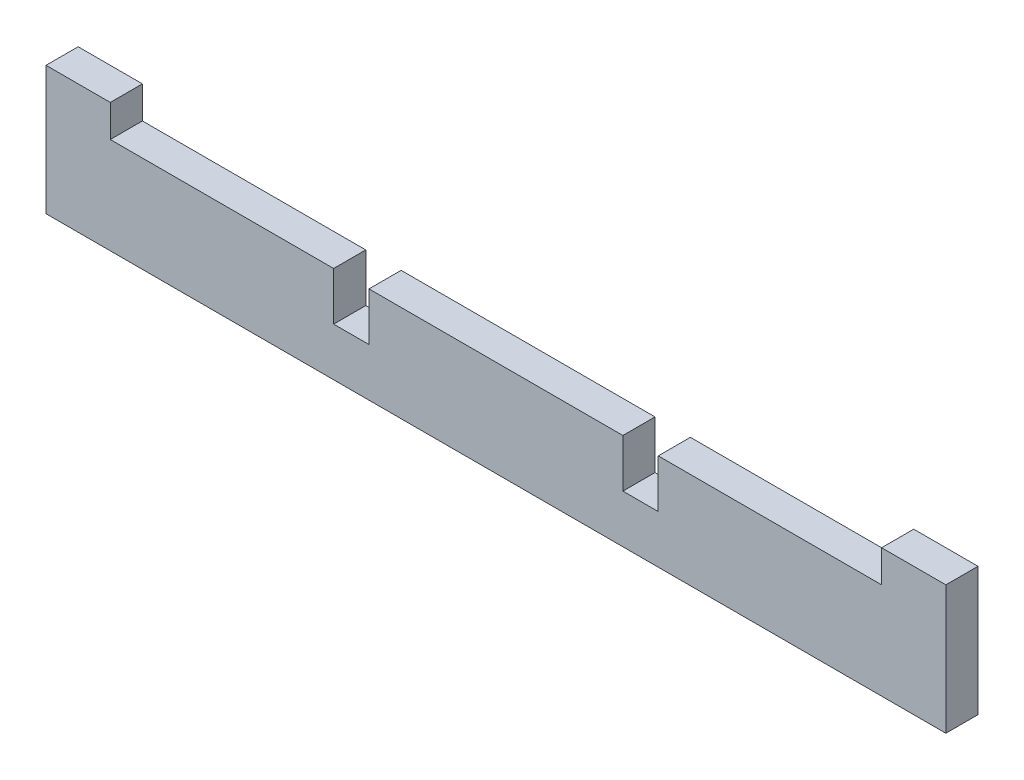
ISO-10303-21;
HEADER;
FILE_DESCRIPTION(('STEP AP214'),'2;1');
FILE_NAME('part.step','',(''),(''),'','','');
FILE_SCHEMA(('AUTOMOTIVE_DESIGN { 1 0 10303 214 1 1 1 1 }'));
ENDSEC;
DATA;
#1=APPLICATION_CONTEXT('core data for automotive mechanical design processes');
#2=APPLICATION_PROTOCOL_DEFINITION('international standard','automotive_design',2000,#1);
#3=PRODUCT_CONTEXT('',#1,'mechanical');
#4=PRODUCT('Part','Part','',(#3));
#5=PRODUCT_RELATED_PRODUCT_CATEGORY('part','',(#4));
#6=PRODUCT_DEFINITION_FORMATION('','',#4);
#7=PRODUCT_DEFINITION_CONTEXT('part definition',#1,'design');
#8=PRODUCT_DEFINITION('design','',#6,#7);
#9=PRODUCT_DEFINITION_SHAPE('','',#8);
#10=(LENGTH_UNIT() NAMED_UNIT(*) SI_UNIT(.MILLI.,.METRE.));
#11=(NAMED_UNIT(*) PLANE_ANGLE_UNIT() SI_UNIT($,.RADIAN.));
#12=(NAMED_UNIT(*) SI_UNIT($,.STERADIAN.) SOLID_ANGLE_UNIT());
#13=UNCERTAINTY_MEASURE_WITH_UNIT(LENGTH_MEASURE(1.E-05),#10,'distance_accuracy_value','');
#14=(GEOMETRIC_REPRESENTATION_CONTEXT(3) GLOBAL_UNCERTAINTY_ASSIGNED_CONTEXT((#13)) GLOBAL_UNIT_ASSIGNED_CONTEXT((#10,
#11,#12)) REPRESENTATION_CONTEXT('',''));
#15=CARTESIAN_POINT('',(0.,0.,0.));
#16=DIRECTION('',(0.,0.,1.));
#17=DIRECTION('',(1.,0.,0.));
#18=AXIS2_PLACEMENT_3D('',#15,#16,#17);
#19=CARTESIAN_POINT('',(663.280484651778,-183.645557824956,2.5));
#20=DIRECTION('',(0.,-1.,0.));
#21=DIRECTION('',(1.,0.,0.));
#22=AXIS2_PLACEMENT_3D('',#19,#20,#21);
#23=PLANE('',#22);
#24=DIRECTION('',(-1.,0.,0.));
#25=VECTOR('',#24,1.);
#26=CARTESIAN_POINT('',(663.280484651778,-183.645557824956,-2.5));
#27=LINE('',#26,#25);
#28=CARTESIAN_POINT('',(673.280484651779,-183.645557824956,-2.5));
#29=VERTEX_POINT('',#28);
#30=CARTESIAN_POINT('',(663.280484651778,-183.645557824956,-2.5));
#31=VERTEX_POINT('',#30);
#32=EDGE_CURVE('E176',#29,#31,#27,.T.);
#33=ORIENTED_EDGE('',*,*,#32,.T.);
#34=DIRECTION('',(0.,0.,-1.));
#35=VECTOR('',#34,1.);
#36=CARTESIAN_POINT('',(663.280484651778,-183.645557824956,2.5));
#37=LINE('',#36,#35);
#38=CARTESIAN_POINT('',(663.280484651778,-183.645557824956,2.5));
#39=VERTEX_POINT('',#38);
#40=EDGE_CURVE('E11',#39,#31,#37,.T.);
#41=ORIENTED_EDGE('',*,*,#40,.F.);
#42=DIRECTION('',(-1.,0.,0.));
#43=VECTOR('',#42,1.);
#44=CARTESIAN_POINT('',(663.280484651778,-183.645557824956,2.5));
#45=LINE('',#44,#43);
#46=CARTESIAN_POINT('',(673.280484651779,-183.645557824956,2.5));
#47=VERTEX_POINT('',#46);
#48=EDGE_CURVE('E206',#47,#39,#45,.T.);
#49=ORIENTED_EDGE('',*,*,#48,.F.);
#50=DIRECTION('',(0.,0.,-1.));
#51=VECTOR('',#50,1.);
#52=CARTESIAN_POINT('',(673.280484651779,-183.645557824956,2.5));
#53=LINE('',#52,#51);
#54=EDGE_CURVE('E172',#47,#29,#53,.T.);
#55=ORIENTED_EDGE('',*,*,#54,.T.);
#56=EDGE_LOOP('',(#33,#41,#49,#55));
#57=FACE_BOUND('',#56,.T.);
#58=ADVANCED_FACE('F32',(#57),#23,.F.);
#59=CARTESIAN_POINT('',(663.280484651778,-188.645557824956,2.5));
#60=DIRECTION('',(1.,0.,0.));
#61=DIRECTION('',(0.,0.,-1.));
#62=AXIS2_PLACEMENT_3D('',#59,#60,#61);
#63=PLANE('',#62);
#64=DIRECTION('',(0.,-1.,0.));
#65=VECTOR('',#64,1.);
#66=CARTESIAN_POINT('',(663.280484651778,-188.645557824956,-2.5));
#67=LINE('',#66,#65);
#68=CARTESIAN_POINT('',(663.280484651778,-188.645557824956,-2.5));
#69=VERTEX_POINT('',#68);
#70=EDGE_CURVE('E179',#31,#69,#67,.T.);
#71=ORIENTED_EDGE('',*,*,#70,.T.);
#72=DIRECTION('',(0.,0.,-1.));
#73=VECTOR('',#72,1.);
#74=CARTESIAN_POINT('',(663.280484651778,-188.645557824956,2.5));
#75=LINE('',#74,#73);
#76=CARTESIAN_POINT('',(663.280484651778,-188.645557824956,2.5));
#77=VERTEX_POINT('',#76);
#78=EDGE_CURVE('E40',#77,#69,#75,.T.);
#79=ORIENTED_EDGE('',*,*,#78,.F.);
#80=DIRECTION('',(0.,-1.,0.));
#81=VECTOR('',#80,1.);
#82=CARTESIAN_POINT('',(663.280484651778,-188.645557824956,2.5));
#83=LINE('',#82,#81);
#84=EDGE_CURVE('E115',#39,#77,#83,.T.);
#85=ORIENTED_EDGE('',*,*,#84,.F.);
#86=ORIENTED_EDGE('',*,*,#40,.T.);
#87=EDGE_LOOP('',(#71,#79,#85,#86));
#88=FACE_BOUND('',#87,.T.);
#89=ADVANCED_FACE('F304',(#88),#63,.F.);
#90=CARTESIAN_POINT('',(663.280484651778,-188.645557824956,2.5));
#91=DIRECTION('',(0.,-1.,0.));
#92=DIRECTION('',(0.,0.,-1.));
#93=AXIS2_PLACEMENT_3D('',#90,#91,#92);
#94=PLANE('',#93);
#95=DIRECTION('',(-1.,0.,0.));
#96=VECTOR('',#95,1.);
#97=CARTESIAN_POINT('',(663.280484651778,-188.645557824956,-2.5));
#98=LINE('',#97,#96);
#99=CARTESIAN_POINT('',(628.530484651779,-188.645557824956,-2.5));
#100=VERTEX_POINT('',#99);
#101=EDGE_CURVE('E181',#69,#100,#98,.T.);
#102=ORIENTED_EDGE('',*,*,#101,.T.);
#103=DIRECTION('',(0.,0.,-1.));
#104=VECTOR('',#103,1.);
#105=CARTESIAN_POINT('',(628.530484651779,-188.645557824956,2.5));
#106=LINE('',#105,#104);
#107=CARTESIAN_POINT('',(628.530484651779,-188.645557824956,2.5));
#108=VERTEX_POINT('',#107);
#109=EDGE_CURVE('E237',#108,#100,#106,.T.);
#110=ORIENTED_EDGE('',*,*,#109,.F.);
#111=DIRECTION('',(-1.,0.,0.));
#112=VECTOR('',#111,1.);
#113=CARTESIAN_POINT('',(663.280484651778,-188.645557824956,2.5));
#114=LINE('',#113,#112);
#115=EDGE_CURVE('E245',#77,#108,#114,.T.);
#116=ORIENTED_EDGE('',*,*,#115,.F.);
#117=ORIENTED_EDGE('',*,*,#78,.T.);
#118=EDGE_LOOP('',(#102,#110,#116,#117));
#119=FACE_BOUND('',#118,.T.);
#120=ADVANCED_FACE('F243',(#119),#94,.F.);
#121=CARTESIAN_POINT('',(628.530484651779,-196.145557824956,2.5));
#122=DIRECTION('',(1.,0.,0.));
#123=DIRECTION('',(0.,0.,-1.));
#124=AXIS2_PLACEMENT_3D('',#121,#122,#123);
#125=PLANE('',#124);
#126=DIRECTION('',(0.,-1.,0.));
#127=VECTOR('',#126,1.);
#128=CARTESIAN_POINT('',(628.530484651779,-196.145557824956,-2.5));
#129=LINE('',#128,#127);
#130=CARTESIAN_POINT('',(628.530484651779,-196.145557824956,-2.5));
#131=VERTEX_POINT('',#130);
#132=EDGE_CURVE('E183',#100,#131,#129,.T.);
#133=ORIENTED_EDGE('',*,*,#132,.T.);
#134=DIRECTION('',(0.,0.,-1.));
#135=VECTOR('',#134,1.);
#136=CARTESIAN_POINT('',(628.530484651779,-196.145557824956,2.5));
#137=LINE('',#136,#135);
#138=CARTESIAN_POINT('',(628.530484651779,-196.145557824956,2.5));
#139=VERTEX_POINT('',#138);
#140=EDGE_CURVE('E234',#139,#131,#137,.T.);
#141=ORIENTED_EDGE('',*,*,#140,.F.);
#142=DIRECTION('',(0.,-1.,0.));
#143=VECTOR('',#142,1.);
#144=CARTESIAN_POINT('',(628.530484651779,-196.145557824956,2.5));
#145=LINE('',#144,#143);
#146=EDGE_CURVE('E263',#108,#139,#145,.T.);
#147=ORIENTED_EDGE('',*,*,#146,.F.);
#148=ORIENTED_EDGE('',*,*,#109,.T.);
#149=EDGE_LOOP('',(#133,#141,#147,#148));
#150=FACE_BOUND('',#149,.T.);
#151=ADVANCED_FACE('F254',(#150),#125,.F.);
#152=CARTESIAN_POINT('',(623.030484651779,-196.145557824956,2.5));
#153=DIRECTION('',(0.,-1.,0.));
#154=DIRECTION('',(0.,0.,-1.));
#155=AXIS2_PLACEMENT_3D('',#152,#153,#154);
#156=PLANE('',#155);
#157=DIRECTION('',(-1.,0.,0.));
#158=VECTOR('',#157,1.);
#159=CARTESIAN_POINT('',(623.030484651779,-196.145557824956,-2.5));
#160=LINE('',#159,#158);
#161=CARTESIAN_POINT('',(623.030484651779,-196.145557824956,-2.5));
#162=VERTEX_POINT('',#161);
#163=EDGE_CURVE('E185',#131,#162,#160,.T.);
#164=ORIENTED_EDGE('',*,*,#163,.T.);
#165=DIRECTION('',(0.,0.,-1.));
#166=VECTOR('',#165,1.);
#167=CARTESIAN_POINT('',(623.030484651779,-196.145557824956,2.5));
#168=LINE('',#167,#166);
#169=CARTESIAN_POINT('',(623.030484651779,-196.145557824956,2.5));
#170=VERTEX_POINT('',#169);
#171=EDGE_CURVE('E231',#170,#162,#168,.T.);
#172=ORIENTED_EDGE('',*,*,#171,.F.);
#173=DIRECTION('',(-1.,0.,0.));
#174=VECTOR('',#173,1.);
#175=CARTESIAN_POINT('',(623.030484651779,-196.145557824956,2.5));
#176=LINE('',#175,#174);
#177=EDGE_CURVE('E260',#139,#170,#176,.T.);
#178=ORIENTED_EDGE('',*,*,#177,.F.);
#179=ORIENTED_EDGE('',*,*,#140,.T.);
#180=EDGE_LOOP('',(#164,#172,#178,#179));
#181=FACE_BOUND('',#180,.T.);
#182=ADVANCED_FACE('F258',(#181),#156,.F.);
#183=CARTESIAN_POINT('',(623.030484651779,-188.645557824956,2.5));
#184=DIRECTION('',(-1.,0.,0.));
#185=DIRECTION('',(0.,0.,1.));
#186=AXIS2_PLACEMENT_3D('',#183,#184,#185);
#187=PLANE('',#186);
#188=DIRECTION('',(0.,1.,0.));
#189=VECTOR('',#188,1.);
#190=CARTESIAN_POINT('',(623.030484651779,-188.645557824956,-2.5));
#191=LINE('',#190,#189);
#192=CARTESIAN_POINT('',(623.030484651779,-188.645557824956,-2.5));
#193=VERTEX_POINT('',#192);
#194=EDGE_CURVE('E187',#162,#193,#191,.T.);
#195=ORIENTED_EDGE('',*,*,#194,.T.);
#196=DIRECTION('',(0.,0.,-1.));
#197=VECTOR('',#196,1.);
#198=CARTESIAN_POINT('',(623.030484651779,-188.645557824956,2.5));
#199=LINE('',#198,#197);
#200=CARTESIAN_POINT('',(623.030484651779,-188.645557824956,2.5));
#201=VERTEX_POINT('',#200);
#202=EDGE_CURVE('E228',#201,#193,#199,.T.);
#203=ORIENTED_EDGE('',*,*,#202,.F.);
#204=DIRECTION('',(0.,1.,0.));
#205=VECTOR('',#204,1.);
#206=CARTESIAN_POINT('',(623.030484651779,-188.645557824956,2.5));
#207=LINE('',#206,#205);
#208=EDGE_CURVE('E262',#170,#201,#207,.T.);
#209=ORIENTED_EDGE('',*,*,#208,.F.);
#210=ORIENTED_EDGE('',*,*,#171,.T.);
#211=EDGE_LOOP('',(#195,#203,#209,#210));
#212=FACE_BOUND('',#211,.T.);
#213=ADVANCED_FACE('F317',(#212),#187,.F.);
#214=CARTESIAN_POINT('',(583.530484651776,-188.645557824956,2.5));
#215=DIRECTION('',(0.,-1.,0.));
#216=DIRECTION('',(0.,0.,-1.));
#217=AXIS2_PLACEMENT_3D('',#214,#215,#216);
#218=PLANE('',#217);
#219=DIRECTION('',(-1.,0.,0.));
#220=VECTOR('',#219,1.);
#221=CARTESIAN_POINT('',(583.530484651776,-188.645557824956,-2.5));
#222=LINE('',#221,#220);
#223=CARTESIAN_POINT('',(583.530484651776,-188.645557824956,-2.5));
#224=VERTEX_POINT('',#223);
#225=EDGE_CURVE('E189',#193,#224,#222,.T.);
#226=ORIENTED_EDGE('',*,*,#225,.T.);
#227=DIRECTION('',(0.,0.,-1.));
#228=VECTOR('',#227,1.);
#229=CARTESIAN_POINT('',(583.530484651776,-188.645557824956,2.5));
#230=LINE('',#229,#228);
#231=CARTESIAN_POINT('',(583.530484651776,-188.645557824956,2.5));
#232=VERTEX_POINT('',#231);
#233=EDGE_CURVE('E225',#232,#224,#230,.T.);
#234=ORIENTED_EDGE('',*,*,#233,.F.);
#235=DIRECTION('',(-1.,0.,0.));
#236=VECTOR('',#235,1.);
#237=CARTESIAN_POINT('',(583.530484651776,-188.645557824956,2.5));
#238=LINE('',#237,#236);
#239=EDGE_CURVE('E265',#201,#232,#238,.T.);
#240=ORIENTED_EDGE('',*,*,#239,.F.);
#241=ORIENTED_EDGE('',*,*,#202,.T.);
#242=EDGE_LOOP('',(#226,#234,#240,#241));
#243=FACE_BOUND('',#242,.T.);
#244=ADVANCED_FACE('F320',(#243),#218,.F.);
#245=CARTESIAN_POINT('',(583.530484651776,-196.145557824956,2.5));
#246=DIRECTION('',(1.,0.,0.));
#247=DIRECTION('',(0.,0.,-1.));
#248=AXIS2_PLACEMENT_3D('',#245,#246,#247);
#249=PLANE('',#248);
#250=DIRECTION('',(0.,-1.,0.));
#251=VECTOR('',#250,1.);
#252=CARTESIAN_POINT('',(583.530484651776,-196.145557824956,-2.5));
#253=LINE('',#252,#251);
#254=CARTESIAN_POINT('',(583.530484651776,-196.145557824956,-2.5));
#255=VERTEX_POINT('',#254);
#256=EDGE_CURVE('E191',#224,#255,#253,.T.);
#257=ORIENTED_EDGE('',*,*,#256,.T.);
#258=DIRECTION('',(0.,0.,-1.));
#259=VECTOR('',#258,1.);
#260=CARTESIAN_POINT('',(583.530484651776,-196.145557824956,2.5));
#261=LINE('',#260,#259);
#262=CARTESIAN_POINT('',(583.530484651776,-196.145557824956,2.5));
#263=VERTEX_POINT('',#262);
#264=EDGE_CURVE('E222',#263,#255,#261,.T.);
#265=ORIENTED_EDGE('',*,*,#264,.F.);
#266=DIRECTION('',(0.,-1.,0.));
#267=VECTOR('',#266,1.);
#268=CARTESIAN_POINT('',(583.530484651776,-196.145557824956,2.5));
#269=LINE('',#268,#267);
#270=EDGE_CURVE('E271',#232,#263,#269,.T.);
#271=ORIENTED_EDGE('',*,*,#270,.F.);
#272=ORIENTED_EDGE('',*,*,#233,.T.);
#273=EDGE_LOOP('',(#257,#265,#271,#272));
#274=FACE_BOUND('',#273,.T.);
#275=ADVANCED_FACE('F324',(#274),#249,.F.);
#276=CARTESIAN_POINT('',(578.030484651776,-196.145557824956,2.5));
#277=DIRECTION('',(0.,-1.,0.));
#278=DIRECTION('',(0.,0.,-1.));
#279=AXIS2_PLACEMENT_3D('',#276,#277,#278);
#280=PLANE('',#279);
#281=DIRECTION('',(-1.,0.,0.));
#282=VECTOR('',#281,1.);
#283=CARTESIAN_POINT('',(578.030484651776,-196.145557824956,-2.5));
#284=LINE('',#283,#282);
#285=CARTESIAN_POINT('',(578.030484651776,-196.145557824956,-2.5));
#286=VERTEX_POINT('',#285);
#287=EDGE_CURVE('E193',#255,#286,#284,.T.);
#288=ORIENTED_EDGE('',*,*,#287,.T.);
#289=DIRECTION('',(0.,0.,-1.));
#290=VECTOR('',#289,1.);
#291=CARTESIAN_POINT('',(578.030484651776,-196.145557824956,2.5));
#292=LINE('',#291,#290);
#293=CARTESIAN_POINT('',(578.030484651776,-196.145557824956,2.5));
#294=VERTEX_POINT('',#293);
#295=EDGE_CURVE('E219',#294,#286,#292,.T.);
#296=ORIENTED_EDGE('',*,*,#295,.F.);
#297=DIRECTION('',(-1.,0.,0.));
#298=VECTOR('',#297,1.);
#299=CARTESIAN_POINT('',(578.030484651776,-196.145557824956,2.5));
#300=LINE('',#299,#298);
#301=EDGE_CURVE('E273',#263,#294,#300,.T.);
#302=ORIENTED_EDGE('',*,*,#301,.F.);
#303=ORIENTED_EDGE('',*,*,#264,.T.);
#304=EDGE_LOOP('',(#288,#296,#302,#303));
#305=FACE_BOUND('',#304,.T.);
#306=ADVANCED_FACE('F328',(#305),#280,.F.);
#307=CARTESIAN_POINT('',(578.030484651776,-188.645557824956,2.5));
#308=DIRECTION('',(-1.,0.,0.));
#309=DIRECTION('',(0.,0.,1.));
#310=AXIS2_PLACEMENT_3D('',#307,#308,#309);
#311=PLANE('',#310);
#312=DIRECTION('',(0.,1.,0.));
#313=VECTOR('',#312,1.);
#314=CARTESIAN_POINT('',(578.030484651776,-188.645557824956,-2.5));
#315=LINE('',#314,#313);
#316=CARTESIAN_POINT('',(578.030484651776,-188.645557824956,-2.5));
#317=VERTEX_POINT('',#316);
#318=EDGE_CURVE('E195',#286,#317,#315,.T.);
#319=ORIENTED_EDGE('',*,*,#318,.T.);
#320=DIRECTION('',(0.,0.,-1.));
#321=VECTOR('',#320,1.);
#322=CARTESIAN_POINT('',(578.030484651776,-188.645557824956,2.5));
#323=LINE('',#322,#321);
#324=CARTESIAN_POINT('',(578.030484651776,-188.645557824956,2.5));
#325=VERTEX_POINT('',#324);
#326=EDGE_CURVE('E216',#325,#317,#323,.T.);
#327=ORIENTED_EDGE('',*,*,#326,.F.);
#328=DIRECTION('',(0.,1.,0.));
#329=VECTOR('',#328,1.);
#330=CARTESIAN_POINT('',(578.030484651776,-188.645557824956,2.5));
#331=LINE('',#330,#329);
#332=EDGE_CURVE('E275',#294,#325,#331,.T.);
#333=ORIENTED_EDGE('',*,*,#332,.F.);
#334=ORIENTED_EDGE('',*,*,#295,.T.);
#335=EDGE_LOOP('',(#319,#327,#333,#334));
#336=FACE_BOUND('',#335,.T.);
#337=ADVANCED_FACE('F332',(#336),#311,.F.);
#338=CARTESIAN_POINT('',(543.280484651776,-188.645557824956,2.5));
#339=DIRECTION('',(0.,-1.,0.));
#340=DIRECTION('',(0.,0.,-1.));
#341=AXIS2_PLACEMENT_3D('',#338,#339,#340);
#342=PLANE('',#341);
#343=DIRECTION('',(-1.,0.,0.));
#344=VECTOR('',#343,1.);
#345=CARTESIAN_POINT('',(543.280484651776,-188.645557824956,-2.5));
#346=LINE('',#345,#344);
#347=CARTESIAN_POINT('',(543.280484651776,-188.645557824956,-2.5));
#348=VERTEX_POINT('',#347);
#349=EDGE_CURVE('E197',#317,#348,#346,.T.);
#350=ORIENTED_EDGE('',*,*,#349,.T.);
#351=DIRECTION('',(0.,0.,-1.));
#352=VECTOR('',#351,1.);
#353=CARTESIAN_POINT('',(543.280484651776,-188.645557824956,2.5));
#354=LINE('',#353,#352);
#355=CARTESIAN_POINT('',(543.280484651776,-188.645557824956,2.5));
#356=VERTEX_POINT('',#355);
#357=EDGE_CURVE('E213',#356,#348,#354,.T.);
#358=ORIENTED_EDGE('',*,*,#357,.F.);
#359=DIRECTION('',(-1.,0.,0.));
#360=VECTOR('',#359,1.);
#361=CARTESIAN_POINT('',(543.280484651776,-188.645557824956,2.5));
#362=LINE('',#361,#360);
#363=EDGE_CURVE('E277',#325,#356,#362,.T.);
#364=ORIENTED_EDGE('',*,*,#363,.F.);
#365=ORIENTED_EDGE('',*,*,#326,.T.);
#366=EDGE_LOOP('',(#350,#358,#364,#365));
#367=FACE_BOUND('',#366,.T.);
#368=ADVANCED_FACE('F336',(#367),#342,.F.);
#369=CARTESIAN_POINT('',(543.280484651776,-183.645557824956,2.5));
#370=DIRECTION('',(-1.,0.,0.));
#371=DIRECTION('',(0.,0.,1.));
#372=AXIS2_PLACEMENT_3D('',#369,#370,#371);
#373=PLANE('',#372);
#374=DIRECTION('',(0.,1.,0.));
#375=VECTOR('',#374,1.);
#376=CARTESIAN_POINT('',(543.280484651776,-183.645557824956,-2.5));
#377=LINE('',#376,#375);
#378=CARTESIAN_POINT('',(543.280484651776,-183.645557824956,-2.5));
#379=VERTEX_POINT('',#378);
#380=EDGE_CURVE('E199',#348,#379,#377,.T.);
#381=ORIENTED_EDGE('',*,*,#380,.T.);
#382=DIRECTION('',(0.,0.,-1.));
#383=VECTOR('',#382,1.);
#384=CARTESIAN_POINT('',(543.280484651776,-183.645557824956,2.5));
#385=LINE('',#384,#383);
#386=CARTESIAN_POINT('',(543.280484651776,-183.645557824956,2.5));
#387=VERTEX_POINT('',#386);
#388=EDGE_CURVE('E210',#387,#379,#385,.T.);
#389=ORIENTED_EDGE('',*,*,#388,.F.);
#390=DIRECTION('',(0.,1.,0.));
#391=VECTOR('',#390,1.);
#392=CARTESIAN_POINT('',(543.280484651776,-183.645557824956,2.5));
#393=LINE('',#392,#391);
#394=EDGE_CURVE('E279',#356,#387,#393,.T.);
#395=ORIENTED_EDGE('',*,*,#394,.F.);
#396=ORIENTED_EDGE('',*,*,#357,.T.);
#397=EDGE_LOOP('',(#381,#389,#395,#396));
#398=FACE_BOUND('',#397,.T.);
#399=ADVANCED_FACE('F285',(#398),#373,.F.);
#400=CARTESIAN_POINT('',(533.280484651777,-183.645557824956,2.5));
#401=DIRECTION('',(0.,-1.,0.));
#402=DIRECTION('',(0.,0.,-1.));
#403=AXIS2_PLACEMENT_3D('',#400,#401,#402);
#404=PLANE('',#403);
#405=DIRECTION('',(-1.,0.,0.));
#406=VECTOR('',#405,1.);
#407=CARTESIAN_POINT('',(533.280484651777,-183.645557824956,-2.5));
#408=LINE('',#407,#406);
#409=CARTESIAN_POINT('',(533.280484651777,-183.645557824956,-2.5));
#410=VERTEX_POINT('',#409);
#411=EDGE_CURVE('E201',#379,#410,#408,.T.);
#412=ORIENTED_EDGE('',*,*,#411,.T.);
#413=DIRECTION('',(0.,0.,-1.));
#414=VECTOR('',#413,1.);
#415=CARTESIAN_POINT('',(533.280484651777,-183.645557824956,2.5));
#416=LINE('',#415,#414);
#417=CARTESIAN_POINT('',(533.280484651777,-183.645557824956,2.5));
#418=VERTEX_POINT('',#417);
#419=EDGE_CURVE('E167',#418,#410,#416,.T.);
#420=ORIENTED_EDGE('',*,*,#419,.F.);
#421=DIRECTION('',(-1.,0.,0.));
#422=VECTOR('',#421,1.);
#423=CARTESIAN_POINT('',(533.280484651777,-183.645557824956,2.5));
#424=LINE('',#423,#422);
#425=EDGE_CURVE('E158',#387,#418,#424,.T.);
#426=ORIENTED_EDGE('',*,*,#425,.F.);
#427=ORIENTED_EDGE('',*,*,#388,.T.);
#428=EDGE_LOOP('',(#412,#420,#426,#427));
#429=FACE_BOUND('',#428,.T.);
#430=ADVANCED_FACE('F289',(#429),#404,.F.);
#431=CARTESIAN_POINT('',(533.280484651777,-203.645557824956,2.5));
#432=DIRECTION('',(1.,0.,0.));
#433=DIRECTION('',(0.,0.,-1.));
#434=AXIS2_PLACEMENT_3D('',#431,#432,#433);
#435=PLANE('',#434);
#436=DIRECTION('',(0.,-1.,0.));
#437=VECTOR('',#436,1.);
#438=CARTESIAN_POINT('',(533.280484651777,-203.645557824956,-2.5));
#439=LINE('',#438,#437);
#440=CARTESIAN_POINT('',(533.280484651777,-203.645557824956,-2.5));
#441=VERTEX_POINT('',#440);
#442=EDGE_CURVE('E166',#410,#441,#439,.T.);
#443=ORIENTED_EDGE('',*,*,#442,.T.);
#444=DIRECTION('',(0.,0.,-1.));
#445=VECTOR('',#444,1.);
#446=CARTESIAN_POINT('',(533.280484651777,-203.645557824956,2.5));
#447=LINE('',#446,#445);
#448=CARTESIAN_POINT('',(533.280484651777,-203.645557824956,2.5));
#449=VERTEX_POINT('',#448);
#450=EDGE_CURVE('E163',#449,#441,#447,.T.);
#451=ORIENTED_EDGE('',*,*,#450,.F.);
#452=DIRECTION('',(0.,-1.,0.));
#453=VECTOR('',#452,1.);
#454=CARTESIAN_POINT('',(533.280484651777,-203.645557824956,2.5));
#455=LINE('',#454,#453);
#456=EDGE_CURVE('E152',#418,#449,#455,.T.);
#457=ORIENTED_EDGE('',*,*,#456,.F.);
#458=ORIENTED_EDGE('',*,*,#419,.T.);
#459=EDGE_LOOP('',(#443,#451,#457,#458));
#460=FACE_BOUND('',#459,.T.);
#461=ADVANCED_FACE('F164',(#460),#435,.F.);
#462=CARTESIAN_POINT('',(673.280484651779,-203.645557824956,2.5));
#463=DIRECTION('',(0.,1.,0.));
#464=DIRECTION('',(0.,0.,1.));
#465=AXIS2_PLACEMENT_3D('',#462,#463,#464);
#466=PLANE('',#465);
#467=DIRECTION('',(1.,0.,0.));
#468=VECTOR('',#467,1.);
#469=CARTESIAN_POINT('',(673.280484651779,-203.645557824956,-2.5));
#470=LINE('',#469,#468);
#471=CARTESIAN_POINT('',(673.280484651779,-203.645557824956,-2.5));
#472=VERTEX_POINT('',#471);
#473=EDGE_CURVE('E101',#441,#472,#470,.T.);
#474=ORIENTED_EDGE('',*,*,#473,.T.);
#475=DIRECTION('',(0.,0.,-1.));
#476=VECTOR('',#475,1.);
#477=CARTESIAN_POINT('',(673.280484651779,-203.645557824956,2.5));
#478=LINE('',#477,#476);
#479=CARTESIAN_POINT('',(673.280484651779,-203.645557824956,2.5));
#480=VERTEX_POINT('',#479);
#481=EDGE_CURVE('E168',#480,#472,#478,.T.);
#482=ORIENTED_EDGE('',*,*,#481,.F.);
#483=DIRECTION('',(1.,0.,0.));
#484=VECTOR('',#483,1.);
#485=CARTESIAN_POINT('',(673.280484651779,-203.645557824956,2.5));
#486=LINE('',#485,#484);
#487=EDGE_CURVE('E156',#449,#480,#486,.T.);
#488=ORIENTED_EDGE('',*,*,#487,.F.);
#489=ORIENTED_EDGE('',*,*,#450,.T.);
#490=EDGE_LOOP('',(#474,#482,#488,#489));
#491=FACE_BOUND('',#490,.T.);
#492=ADVANCED_FACE('F170',(#491),#466,.F.);
#493=CARTESIAN_POINT('',(673.280484651779,-183.645557824956,2.5));
#494=DIRECTION('',(-1.,0.,0.));
#495=DIRECTION('',(0.,0.,1.));
#496=AXIS2_PLACEMENT_3D('',#493,#494,#495);
#497=PLANE('',#496);
#498=DIRECTION('',(0.,1.,0.));
#499=VECTOR('',#498,1.);
#500=CARTESIAN_POINT('',(673.280484651779,-183.645557824956,-2.5));
#501=LINE('',#500,#499);
#502=EDGE_CURVE('E107',#472,#29,#501,.T.);
#503=ORIENTED_EDGE('',*,*,#502,.T.);
#504=ORIENTED_EDGE('',*,*,#54,.F.);
#505=DIRECTION('',(0.,1.,0.));
#506=VECTOR('',#505,1.);
#507=CARTESIAN_POINT('',(673.280484651779,-183.645557824956,2.5));
#508=LINE('',#507,#506);
#509=EDGE_CURVE('E48',#480,#47,#508,.T.);
#510=ORIENTED_EDGE('',*,*,#509,.F.);
#511=ORIENTED_EDGE('',*,*,#481,.T.);
#512=EDGE_LOOP('',(#503,#504,#510,#511));
#513=FACE_BOUND('',#512,.T.);
#514=ADVANCED_FACE('F293',(#513),#497,.F.);
#515=CARTESIAN_POINT('',(0.,0.,2.5));
#516=DIRECTION('',(0.,0.,-1.));
#517=DIRECTION('',(-1.,0.,0.));
#518=AXIS2_PLACEMENT_3D('',#515,#516,#517);
#519=PLANE('',#518);
#520=ORIENTED_EDGE('',*,*,#48,.T.);
#521=ORIENTED_EDGE('',*,*,#84,.T.);
#522=ORIENTED_EDGE('',*,*,#115,.T.);
#523=ORIENTED_EDGE('',*,*,#146,.T.);
#524=ORIENTED_EDGE('',*,*,#177,.T.);
#525=ORIENTED_EDGE('',*,*,#208,.T.);
#526=ORIENTED_EDGE('',*,*,#239,.T.);
#527=ORIENTED_EDGE('',*,*,#270,.T.);
#528=ORIENTED_EDGE('',*,*,#301,.T.);
#529=ORIENTED_EDGE('',*,*,#332,.T.);
#530=ORIENTED_EDGE('',*,*,#363,.T.);
#531=ORIENTED_EDGE('',*,*,#394,.T.);
#532=ORIENTED_EDGE('',*,*,#425,.T.);
#533=ORIENTED_EDGE('',*,*,#456,.T.);
#534=ORIENTED_EDGE('',*,*,#487,.T.);
#535=ORIENTED_EDGE('',*,*,#509,.T.);
#536=EDGE_LOOP('',(#520,#521,#522,#523,#524,#525,#526,#527,#528,#529,#530,#531,#532,#533,#534,#535));
#537=FACE_BOUND('',#536,.T.);
#538=ADVANCED_FACE('F154',(#537),#519,.F.);
#539=CARTESIAN_POINT('',(0.,0.,-2.5));
#540=DIRECTION('',(0.,0.,-1.));
#541=DIRECTION('',(-1.,0.,0.));
#542=AXIS2_PLACEMENT_3D('',#539,#540,#541);
#543=PLANE('',#542);
#544=ORIENTED_EDGE('',*,*,#32,.F.);
#545=ORIENTED_EDGE('',*,*,#502,.F.);
#546=ORIENTED_EDGE('',*,*,#473,.F.);
#547=ORIENTED_EDGE('',*,*,#442,.F.);
#548=ORIENTED_EDGE('',*,*,#411,.F.);
#549=ORIENTED_EDGE('',*,*,#380,.F.);
#550=ORIENTED_EDGE('',*,*,#349,.F.);
#551=ORIENTED_EDGE('',*,*,#318,.F.);
#552=ORIENTED_EDGE('',*,*,#287,.F.);
#553=ORIENTED_EDGE('',*,*,#256,.F.);
#554=ORIENTED_EDGE('',*,*,#225,.F.);
#555=ORIENTED_EDGE('',*,*,#194,.F.);
#556=ORIENTED_EDGE('',*,*,#163,.F.);
#557=ORIENTED_EDGE('',*,*,#132,.F.);
#558=ORIENTED_EDGE('',*,*,#101,.F.);
#559=ORIENTED_EDGE('',*,*,#70,.F.);
#560=EDGE_LOOP('',(#544,#545,#546,#547,#548,#549,#550,#551,#552,#553,#554,#555,#556,#557,#558,#559));
#561=FACE_BOUND('',#560,.T.);
#562=ADVANCED_FACE('F249',(#561),#543,.T.);
#563=CLOSED_SHELL('',(#58,#89,#120,#151,#182,#213,#244,#275,#306,#337,#368,#399,#430,#461,#492,
#514,#538,#562));
#564=MANIFOLD_SOLID_BREP('B2',#563);
#565=ADVANCED_BREP_SHAPE_REPRESENTATION('',(#18,#564),#14);
#566=SHAPE_DEFINITION_REPRESENTATION(#9,#565);
ENDSEC;
END-ISO-10303-21;
